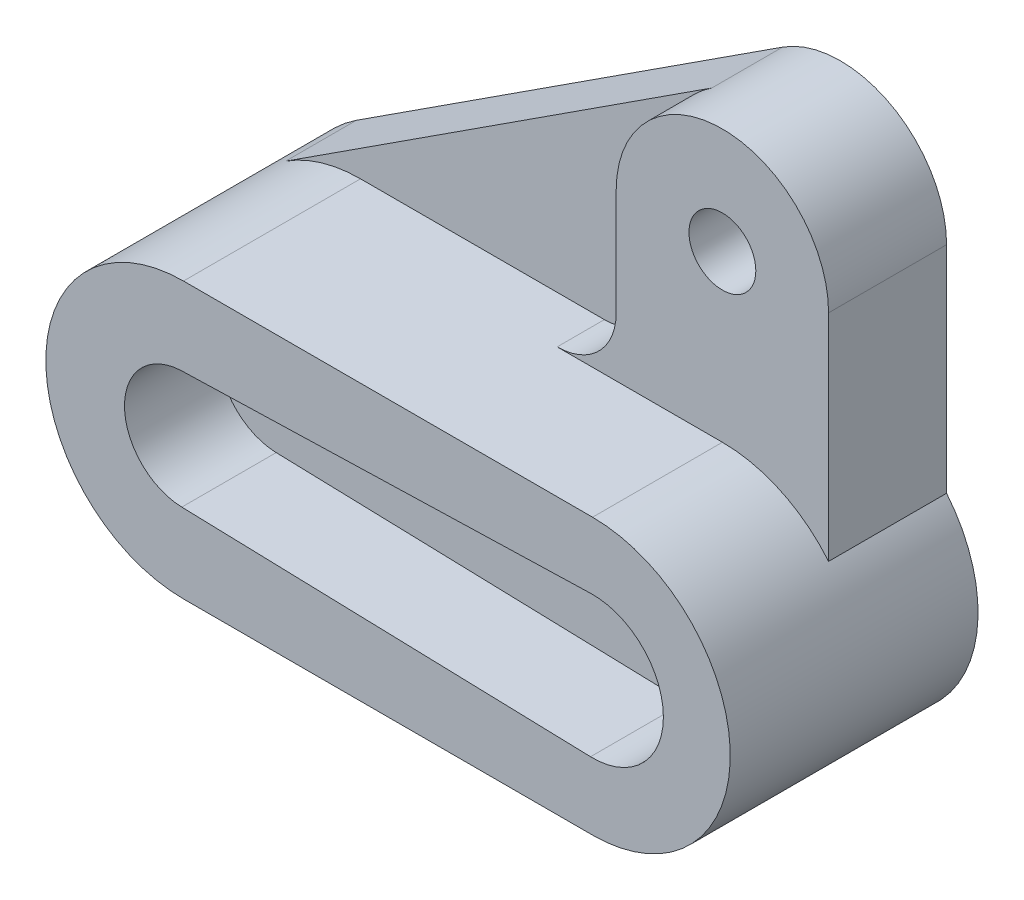
ISO-10303-21;
HEADER;
FILE_DESCRIPTION(('STEP AP214'),'2;1');
FILE_NAME('part.step','',(''),(''),'','','');
FILE_SCHEMA(('AUTOMOTIVE_DESIGN { 1 0 10303 214 1 1 1 1 }'));
ENDSEC;
DATA;
#1=APPLICATION_CONTEXT('core data for automotive mechanical design processes');
#2=APPLICATION_PROTOCOL_DEFINITION('international standard','automotive_design',2000,#1);
#3=PRODUCT_CONTEXT('',#1,'mechanical');
#4=PRODUCT('Part','Part','',(#3));
#5=PRODUCT_RELATED_PRODUCT_CATEGORY('part','',(#4));
#6=PRODUCT_DEFINITION_FORMATION('','',#4);
#7=PRODUCT_DEFINITION_CONTEXT('part definition',#1,'design');
#8=PRODUCT_DEFINITION('design','',#6,#7);
#9=PRODUCT_DEFINITION_SHAPE('','',#8);
#10=(LENGTH_UNIT() NAMED_UNIT(*) SI_UNIT(.MILLI.,.METRE.));
#11=(NAMED_UNIT(*) PLANE_ANGLE_UNIT() SI_UNIT($,.RADIAN.));
#12=(NAMED_UNIT(*) SI_UNIT($,.STERADIAN.) SOLID_ANGLE_UNIT());
#13=UNCERTAINTY_MEASURE_WITH_UNIT(LENGTH_MEASURE(1.E-05),#10,'distance_accuracy_value','');
#14=(GEOMETRIC_REPRESENTATION_CONTEXT(3) GLOBAL_UNCERTAINTY_ASSIGNED_CONTEXT((#13)) GLOBAL_UNIT_ASSIGNED_CONTEXT((#10,
#11,#12)) REPRESENTATION_CONTEXT('',''));
#15=CARTESIAN_POINT('',(0.,0.,0.));
#16=DIRECTION('',(0.,0.,1.));
#17=DIRECTION('',(1.,0.,0.));
#18=AXIS2_PLACEMENT_3D('',#15,#16,#17);
#19=CARTESIAN_POINT('',(-58.2524439912202,0.,-15.));
#20=DIRECTION('',(0.,0.,1.));
#21=DIRECTION('',(1.,0.,0.));
#22=AXIS2_PLACEMENT_3D('',#19,#20,#21);
#23=CYLINDRICAL_SURFACE('',#22,35.);
#24=CARTESIAN_POINT('',(-58.2524439912202,0.,3.));
#25=DIRECTION('',(0.,0.,1.));
#26=DIRECTION('',(1.,0.,0.));
#27=AXIS2_PLACEMENT_3D('',#24,#25,#26);
#28=CIRCLE('',#27,35.);
#29=CARTESIAN_POINT('',(-58.2524439912202,35.,3.));
#30=VERTEX_POINT('',#29);
#31=CARTESIAN_POINT('',(-77.3000748466596,29.3630338826715,3.));
#32=VERTEX_POINT('',#31);
#33=EDGE_CURVE('E57',#30,#32,#28,.T.);
#34=ORIENTED_EDGE('',*,*,#33,.T.);
#35=DIRECTION('',(0.,0.,1.));
#36=VECTOR('',#35,1.);
#37=CARTESIAN_POINT('',(-77.3000748466596,29.3630338826715,-15.));
#38=LINE('',#37,#36);
#39=CARTESIAN_POINT('',(-77.3000748466596,29.3630338826715,-15.));
#40=VERTEX_POINT('',#39);
#41=EDGE_CURVE('E184',#40,#32,#38,.T.);
#42=ORIENTED_EDGE('',*,*,#41,.F.);
#43=CARTESIAN_POINT('',(-58.2524439912202,0.,-15.));
#44=DIRECTION('',(0.,0.,1.));
#45=DIRECTION('',(1.,0.,0.));
#46=AXIS2_PLACEMENT_3D('',#43,#44,#45);
#47=CIRCLE('',#46,35.);
#48=CARTESIAN_POINT('',(-58.2524439912202,-35.,-15.));
#49=VERTEX_POINT('',#48);
#50=EDGE_CURVE('E342',#40,#49,#47,.T.);
#51=ORIENTED_EDGE('',*,*,#50,.T.);
#52=DIRECTION('',(0.,0.,1.));
#53=VECTOR('',#52,1.);
#54=CARTESIAN_POINT('',(-58.2524439912202,-35.,-15.));
#55=LINE('',#54,#53);
#56=CARTESIAN_POINT('',(-58.2524439912202,-35.,48.));
#57=VERTEX_POINT('',#56);
#58=EDGE_CURVE('E49',#49,#57,#55,.T.);
#59=ORIENTED_EDGE('',*,*,#58,.T.);
#60=CARTESIAN_POINT('',(-58.2524439912202,0.,48.));
#61=DIRECTION('',(0.,0.,1.));
#62=DIRECTION('',(1.,0.,0.));
#63=AXIS2_PLACEMENT_3D('',#60,#61,#62);
#64=CIRCLE('',#63,35.);
#65=CARTESIAN_POINT('',(-58.2524439912202,35.,48.));
#66=VERTEX_POINT('',#65);
#67=EDGE_CURVE('E316',#66,#57,#64,.T.);
#68=ORIENTED_EDGE('',*,*,#67,.F.);
#69=DIRECTION('',(0.,0.,1.));
#70=VECTOR('',#69,1.);
#71=CARTESIAN_POINT('',(-58.2524439912202,35.,-15.));
#72=LINE('',#71,#70);
#73=EDGE_CURVE('E352',#30,#66,#72,.T.);
#74=ORIENTED_EDGE('',*,*,#73,.F.);
#75=EDGE_LOOP('',(#34,#42,#51,#59,#68,#74));
#76=FACE_BOUND('',#75,.T.);
#77=ADVANCED_FACE('F39',(#76),#23,.T.);
#78=CARTESIAN_POINT('',(45.7475560087798,0.,-15.));
#79=DIRECTION('',(0.,0.,1.));
#80=DIRECTION('',(1.,0.,0.));
#81=AXIS2_PLACEMENT_3D('',#78,#79,#80);
#82=CYLINDRICAL_SURFACE('',#81,35.);
#83=CARTESIAN_POINT('',(45.7475560087798,0.,-15.));
#84=DIRECTION('',(0.,0.,1.));
#85=DIRECTION('',(1.,0.,0.));
#86=AXIS2_PLACEMENT_3D('',#83,#84,#85);
#87=CIRCLE('',#86,35.);
#88=CARTESIAN_POINT('',(45.7475560087798,-35.,-15.));
#89=VERTEX_POINT('',#88);
#90=CARTESIAN_POINT('',(72.7475560087798,22.2710574513201,-15.));
#91=VERTEX_POINT('',#90);
#92=EDGE_CURVE('E338',#89,#91,#87,.T.);
#93=ORIENTED_EDGE('',*,*,#92,.T.);
#94=DIRECTION('',(0.,0.,1.));
#95=VECTOR('',#94,1.);
#96=CARTESIAN_POINT('',(72.7475560087798,22.2710574513201,-15.));
#97=LINE('',#96,#95);
#98=CARTESIAN_POINT('',(72.7475560087798,22.2710574513201,15.));
#99=VERTEX_POINT('',#98);
#100=EDGE_CURVE('E257',#91,#99,#97,.T.);
#101=ORIENTED_EDGE('',*,*,#100,.T.);
#102=CARTESIAN_POINT('',(45.7475560087798,0.,15.));
#103=DIRECTION('',(0.,0.,1.));
#104=DIRECTION('',(1.,0.,0.));
#105=AXIS2_PLACEMENT_3D('',#102,#103,#104);
#106=CIRCLE('',#105,35.);
#107=CARTESIAN_POINT('',(45.7475560087798,35.,15.));
#108=VERTEX_POINT('',#107);
#109=EDGE_CURVE('E217',#99,#108,#106,.T.);
#110=ORIENTED_EDGE('',*,*,#109,.T.);
#111=DIRECTION('',(0.,0.,1.));
#112=VECTOR('',#111,1.);
#113=CARTESIAN_POINT('',(45.7475560087798,35.,-15.));
#114=LINE('',#113,#112);
#115=CARTESIAN_POINT('',(45.7475560087798,35.,48.));
#116=VERTEX_POINT('',#115);
#117=EDGE_CURVE('E355',#108,#116,#114,.T.);
#118=ORIENTED_EDGE('',*,*,#117,.T.);
#119=CARTESIAN_POINT('',(45.7475560087798,0.,48.));
#120=DIRECTION('',(0.,0.,1.));
#121=DIRECTION('',(1.,0.,0.));
#122=AXIS2_PLACEMENT_3D('',#119,#120,#121);
#123=CIRCLE('',#122,35.);
#124=CARTESIAN_POINT('',(45.7475560087798,-35.,48.));
#125=VERTEX_POINT('',#124);
#126=EDGE_CURVE('E308',#125,#116,#123,.T.);
#127=ORIENTED_EDGE('',*,*,#126,.F.);
#128=DIRECTION('',(0.,0.,1.));
#129=VECTOR('',#128,1.);
#130=CARTESIAN_POINT('',(45.7475560087798,-35.,-15.));
#131=LINE('',#130,#129);
#132=EDGE_CURVE('E11',#89,#125,#131,.T.);
#133=ORIENTED_EDGE('',*,*,#132,.F.);
#134=EDGE_LOOP('',(#93,#101,#110,#118,#127,#133));
#135=FACE_BOUND('',#134,.T.);
#136=ADVANCED_FACE('F417',(#135),#82,.T.);
#137=CARTESIAN_POINT('',(0.,35.,-15.));
#138=DIRECTION('',(0.,-1.,0.));
#139=DIRECTION('',(0.,0.,-1.));
#140=AXIS2_PLACEMENT_3D('',#137,#138,#139);
#141=PLANE('',#140);
#142=DIRECTION('',(0.,0.,1.));
#143=VECTOR('',#142,1.);
#144=CARTESIAN_POINT('',(3.74755600877969,35.,-15.));
#145=LINE('',#144,#143);
#146=CARTESIAN_POINT('',(3.74755600877969,35.,3.));
#147=VERTEX_POINT('',#146);
#148=CARTESIAN_POINT('',(3.74755600877969,35.,15.));
#149=VERTEX_POINT('',#148);
#150=EDGE_CURVE('E246',#147,#149,#145,.T.);
#151=ORIENTED_EDGE('',*,*,#150,.F.);
#152=DIRECTION('',(1.,0.,0.));
#153=VECTOR('',#152,1.);
#154=CARTESIAN_POINT('',(0.,35.,3.));
#155=LINE('',#154,#153);
#156=EDGE_CURVE('E65',#30,#147,#155,.T.);
#157=ORIENTED_EDGE('',*,*,#156,.F.);
#158=ORIENTED_EDGE('',*,*,#73,.T.);
#159=DIRECTION('',(1.,0.,0.));
#160=VECTOR('',#159,1.);
#161=CARTESIAN_POINT('',(0.,35.,48.));
#162=LINE('',#161,#160);
#163=EDGE_CURVE('E312',#66,#116,#162,.T.);
#164=ORIENTED_EDGE('',*,*,#163,.T.);
#165=ORIENTED_EDGE('',*,*,#117,.F.);
#166=DIRECTION('',(1.,0.,0.));
#167=VECTOR('',#166,1.);
#168=CARTESIAN_POINT('',(0.,35.,15.));
#169=LINE('',#168,#167);
#170=EDGE_CURVE('E214',#149,#108,#169,.T.);
#171=ORIENTED_EDGE('',*,*,#170,.F.);
#172=EDGE_LOOP('',(#151,#157,#158,#164,#165,#171));
#173=FACE_BOUND('',#172,.T.);
#174=ADVANCED_FACE('F422',(#173),#141,.F.);
#175=CARTESIAN_POINT('',(45.7475560087798,0.,-15.));
#176=DIRECTION('',(0.,0.,1.));
#177=DIRECTION('',(1.,0.,0.));
#178=AXIS2_PLACEMENT_3D('',#175,#176,#177);
#179=CYLINDRICAL_SURFACE('',#178,18.);
#180=CARTESIAN_POINT('',(45.7475560087798,0.,0.));
#181=DIRECTION('',(0.,0.,1.));
#182=DIRECTION('',(1.,0.,0.));
#183=AXIS2_PLACEMENT_3D('',#180,#181,#182);
#184=CIRCLE('',#183,18.);
#185=CARTESIAN_POINT('',(45.2283252395491,-17.9925095361454,0.));
#186=VERTEX_POINT('',#185);
#187=CARTESIAN_POINT('',(45.2283252395491,17.9925095361454,0.));
#188=VERTEX_POINT('',#187);
#189=EDGE_CURVE('E282',#186,#188,#184,.T.);
#190=ORIENTED_EDGE('',*,*,#189,.T.);
#191=DIRECTION('',(0.,0.,1.));
#192=VECTOR('',#191,1.);
#193=CARTESIAN_POINT('',(45.2283252395491,17.9925095361454,-15.));
#194=LINE('',#193,#192);
#195=CARTESIAN_POINT('',(45.2283252395491,17.9925095361454,-15.));
#196=VERTEX_POINT('',#195);
#197=EDGE_CURVE('E358',#196,#188,#194,.T.);
#198=ORIENTED_EDGE('',*,*,#197,.F.);
#199=CARTESIAN_POINT('',(45.7475560087798,0.,-15.));
#200=DIRECTION('',(0.,0.,1.));
#201=DIRECTION('',(1.,0.,0.));
#202=AXIS2_PLACEMENT_3D('',#199,#200,#201);
#203=CIRCLE('',#202,18.);
#204=CARTESIAN_POINT('',(45.2283252395491,-17.9925095361454,-15.));
#205=VERTEX_POINT('',#204);
#206=EDGE_CURVE('E324',#205,#196,#203,.T.);
#207=ORIENTED_EDGE('',*,*,#206,.F.);
#208=DIRECTION('',(0.,0.,1.));
#209=VECTOR('',#208,1.);
#210=CARTESIAN_POINT('',(45.2283252395491,-17.9925095361454,-15.));
#211=LINE('',#210,#209);
#212=EDGE_CURVE('E43',#205,#186,#211,.T.);
#213=ORIENTED_EDGE('',*,*,#212,.T.);
#214=EDGE_LOOP('',(#190,#198,#207,#213));
#215=FACE_BOUND('',#214,.T.);
#216=ADVANCED_FACE('F430',(#215),#179,.F.);
#217=CARTESIAN_POINT('',(-0.481164200806304,16.6734176487363,-15.));
#218=DIRECTION('',(-0.0288461538461538,0.99958386311919,0.));
#219=DIRECTION('',(-0.99958386311919,-0.0288461538461538,0.));
#220=AXIS2_PLACEMENT_3D('',#217,#218,#219);
#221=PLANE('',#220);
#222=DIRECTION('',(-0.99958386311919,-0.0288461538461538,0.));
#223=VECTOR('',#222,1.);
#224=CARTESIAN_POINT('',(-0.481164200806304,16.6734176487363,0.));
#225=LINE('',#224,#223);
#226=CARTESIAN_POINT('',(-58.6851362989125,14.9937579467879,0.));
#227=VERTEX_POINT('',#226);
#228=EDGE_CURVE('E286',#188,#227,#225,.T.);
#229=ORIENTED_EDGE('',*,*,#228,.T.);
#230=DIRECTION('',(0.,0.,1.));
#231=VECTOR('',#230,1.);
#232=CARTESIAN_POINT('',(-58.6851362989125,14.9937579467879,-15.));
#233=LINE('',#232,#231);
#234=CARTESIAN_POINT('',(-58.6851362989125,14.9937579467879,-15.));
#235=VERTEX_POINT('',#234);
#236=EDGE_CURVE('E363',#235,#227,#233,.T.);
#237=ORIENTED_EDGE('',*,*,#236,.F.);
#238=DIRECTION('',(-0.99958386311919,-0.0288461538461538,0.));
#239=VECTOR('',#238,1.);
#240=CARTESIAN_POINT('',(-0.481164200806304,16.6734176487363,-15.));
#241=LINE('',#240,#239);
#242=EDGE_CURVE('E335',#196,#235,#241,.T.);
#243=ORIENTED_EDGE('',*,*,#242,.F.);
#244=ORIENTED_EDGE('',*,*,#197,.T.);
#245=EDGE_LOOP('',(#229,#237,#243,#244));
#246=FACE_BOUND('',#245,.T.);
#247=ADVANCED_FACE('F413',(#246),#221,.F.);
#248=CARTESIAN_POINT('',(-58.2524439912202,0.,-15.));
#249=DIRECTION('',(0.,0.,1.));
#250=DIRECTION('',(1.,0.,0.));
#251=AXIS2_PLACEMENT_3D('',#248,#249,#250);
#252=CYLINDRICAL_SURFACE('',#251,15.);
#253=CARTESIAN_POINT('',(-58.2524439912202,0.,0.));
#254=DIRECTION('',(0.,0.,1.));
#255=DIRECTION('',(1.,0.,0.));
#256=AXIS2_PLACEMENT_3D('',#253,#254,#255);
#257=CIRCLE('',#256,15.);
#258=CARTESIAN_POINT('',(-58.6851362989125,-14.9937579467879,0.));
#259=VERTEX_POINT('',#258);
#260=EDGE_CURVE('E267',#227,#259,#257,.T.);
#261=ORIENTED_EDGE('',*,*,#260,.T.);
#262=DIRECTION('',(0.,0.,1.));
#263=VECTOR('',#262,1.);
#264=CARTESIAN_POINT('',(-58.6851362989125,-14.9937579467879,-15.));
#265=LINE('',#264,#263);
#266=CARTESIAN_POINT('',(-58.6851362989125,-14.9937579467879,-15.));
#267=VERTEX_POINT('',#266);
#268=EDGE_CURVE('E367',#267,#259,#265,.T.);
#269=ORIENTED_EDGE('',*,*,#268,.F.);
#270=CARTESIAN_POINT('',(-58.2524439912202,0.,-15.));
#271=DIRECTION('',(0.,0.,1.));
#272=DIRECTION('',(1.,0.,0.));
#273=AXIS2_PLACEMENT_3D('',#270,#271,#272);
#274=CIRCLE('',#273,15.);
#275=EDGE_CURVE('E332',#235,#267,#274,.T.);
#276=ORIENTED_EDGE('',*,*,#275,.F.);
#277=ORIENTED_EDGE('',*,*,#236,.T.);
#278=EDGE_LOOP('',(#261,#269,#276,#277));
#279=FACE_BOUND('',#278,.T.);
#280=ADVANCED_FACE('F405',(#279),#252,.F.);
#281=CARTESIAN_POINT('',(-0.481164200806303,-16.6734176487363,-15.));
#282=DIRECTION('',(0.0288461538461538,0.99958386311919,0.));
#283=DIRECTION('',(-0.99958386311919,0.0288461538461538,0.));
#284=AXIS2_PLACEMENT_3D('',#281,#282,#283);
#285=PLANE('',#284);
#286=ORIENTED_EDGE('',*,*,#268,.T.);
#287=DIRECTION('',(-0.99958386311919,0.0288461538461538,0.));
#288=VECTOR('',#287,1.);
#289=CARTESIAN_POINT('',(-0.481164200806303,-16.6734176487363,0.));
#290=LINE('',#289,#288);
#291=EDGE_CURVE('E250',#186,#259,#290,.T.);
#292=ORIENTED_EDGE('',*,*,#291,.F.);
#293=ORIENTED_EDGE('',*,*,#212,.F.);
#294=DIRECTION('',(-0.99958386311919,0.0288461538461538,0.));
#295=VECTOR('',#294,1.);
#296=CARTESIAN_POINT('',(-0.481164200806303,-16.6734176487363,-15.));
#297=LINE('',#296,#295);
#298=EDGE_CURVE('E328',#205,#267,#297,.T.);
#299=ORIENTED_EDGE('',*,*,#298,.T.);
#300=EDGE_LOOP('',(#286,#292,#293,#299));
#301=FACE_BOUND('',#300,.T.);
#302=ADVANCED_FACE('F411',(#301),#285,.T.);
#303=CARTESIAN_POINT('',(0.,-35.,-15.));
#304=DIRECTION('',(0.,-1.,0.));
#305=DIRECTION('',(1.,0.,0.));
#306=AXIS2_PLACEMENT_3D('',#303,#304,#305);
#307=PLANE('',#306);
#308=ORIENTED_EDGE('',*,*,#132,.T.);
#309=DIRECTION('',(1.,0.,0.));
#310=VECTOR('',#309,1.);
#311=CARTESIAN_POINT('',(0.,-35.,48.));
#312=LINE('',#311,#310);
#313=EDGE_CURVE('E320',#57,#125,#312,.T.);
#314=ORIENTED_EDGE('',*,*,#313,.F.);
#315=ORIENTED_EDGE('',*,*,#58,.F.);
#316=DIRECTION('',(1.,0.,0.));
#317=VECTOR('',#316,1.);
#318=CARTESIAN_POINT('',(0.,-35.,-15.));
#319=LINE('',#318,#317);
#320=EDGE_CURVE('E345',#49,#89,#319,.T.);
#321=ORIENTED_EDGE('',*,*,#320,.T.);
#322=EDGE_LOOP('',(#308,#314,#315,#321));
#323=FACE_BOUND('',#322,.T.);
#324=ADVANCED_FACE('F427',(#323),#307,.T.);
#325=CARTESIAN_POINT('',(45.2283252395491,17.9925095361454,24.));
#326=VERTEX_POINT('',#325);
#327=CARTESIAN_POINT('',(45.2283252395491,17.9925095361454,48.));
#328=VERTEX_POINT('',#327);
#329=EDGE_CURVE('E362',#326,#328,#194,.T.);
#330=ORIENTED_EDGE('',*,*,#329,.F.);
#331=CARTESIAN_POINT('',(45.7475560087798,0.,24.));
#332=DIRECTION('',(0.,0.,1.));
#333=DIRECTION('',(1.,0.,0.));
#334=AXIS2_PLACEMENT_3D('',#331,#332,#333);
#335=CIRCLE('',#334,18.);
#336=CARTESIAN_POINT('',(45.2283252395491,-17.9925095361454,24.));
#337=VERTEX_POINT('',#336);
#338=EDGE_CURVE('E266',#337,#326,#335,.T.);
#339=ORIENTED_EDGE('',*,*,#338,.F.);
#340=CARTESIAN_POINT('',(45.2283252395491,-17.9925095361454,48.));
#341=VERTEX_POINT('',#340);
#342=EDGE_CURVE('E348',#337,#341,#211,.T.);
#343=ORIENTED_EDGE('',*,*,#342,.T.);
#344=CARTESIAN_POINT('',(45.7475560087798,0.,48.));
#345=DIRECTION('',(0.,0.,1.));
#346=DIRECTION('',(1.,0.,0.));
#347=AXIS2_PLACEMENT_3D('',#344,#345,#346);
#348=CIRCLE('',#347,18.);
#349=EDGE_CURVE('E279',#341,#328,#348,.T.);
#350=ORIENTED_EDGE('',*,*,#349,.T.);
#351=EDGE_LOOP('',(#330,#339,#343,#350));
#352=FACE_BOUND('',#351,.T.);
#353=ADVANCED_FACE('F41',(#352),#179,.F.);
#354=CARTESIAN_POINT('',(-58.6851362989125,14.9937579467879,24.));
#355=VERTEX_POINT('',#354);
#356=CARTESIAN_POINT('',(-58.6851362989125,14.9937579467879,48.));
#357=VERTEX_POINT('',#356);
#358=EDGE_CURVE('E366',#355,#357,#233,.T.);
#359=ORIENTED_EDGE('',*,*,#358,.F.);
#360=DIRECTION('',(-0.99958386311919,-0.0288461538461538,0.));
#361=VECTOR('',#360,1.);
#362=CARTESIAN_POINT('',(-0.481164200806304,16.6734176487363,24.));
#363=LINE('',#362,#361);
#364=EDGE_CURVE('E271',#326,#355,#363,.T.);
#365=ORIENTED_EDGE('',*,*,#364,.F.);
#366=ORIENTED_EDGE('',*,*,#329,.T.);
#367=DIRECTION('',(-0.99958386311919,-0.0288461538461538,0.));
#368=VECTOR('',#367,1.);
#369=CARTESIAN_POINT('',(-0.481164200806304,16.6734176487363,48.));
#370=LINE('',#369,#368);
#371=EDGE_CURVE('E304',#328,#357,#370,.T.);
#372=ORIENTED_EDGE('',*,*,#371,.T.);
#373=EDGE_LOOP('',(#359,#365,#366,#372));
#374=FACE_BOUND('',#373,.T.);
#375=ADVANCED_FACE('F397',(#374),#221,.F.);
#376=CARTESIAN_POINT('',(-58.6851362989125,-14.9937579467879,24.));
#377=VERTEX_POINT('',#376);
#378=CARTESIAN_POINT('',(-58.6851362989125,-14.9937579467879,48.));
#379=VERTEX_POINT('',#378);
#380=EDGE_CURVE('E370',#377,#379,#265,.T.);
#381=ORIENTED_EDGE('',*,*,#380,.F.);
#382=CARTESIAN_POINT('',(-58.2524439912202,0.,24.));
#383=DIRECTION('',(0.,0.,1.));
#384=DIRECTION('',(1.,0.,0.));
#385=AXIS2_PLACEMENT_3D('',#382,#383,#384);
#386=CIRCLE('',#385,15.);
#387=EDGE_CURVE('E275',#355,#377,#386,.T.);
#388=ORIENTED_EDGE('',*,*,#387,.F.);
#389=ORIENTED_EDGE('',*,*,#358,.T.);
#390=CARTESIAN_POINT('',(-58.2524439912202,0.,48.));
#391=DIRECTION('',(0.,0.,1.));
#392=DIRECTION('',(1.,0.,0.));
#393=AXIS2_PLACEMENT_3D('',#390,#391,#392);
#394=CIRCLE('',#393,15.);
#395=EDGE_CURVE('E300',#357,#379,#394,.T.);
#396=ORIENTED_EDGE('',*,*,#395,.T.);
#397=EDGE_LOOP('',(#381,#388,#389,#396));
#398=FACE_BOUND('',#397,.T.);
#399=ADVANCED_FACE('F402',(#398),#252,.F.);
#400=DIRECTION('',(-0.99958386311919,0.0288461538461538,0.));
#401=VECTOR('',#400,1.);
#402=CARTESIAN_POINT('',(-0.481164200806303,-16.6734176487363,24.));
#403=LINE('',#402,#401);
#404=EDGE_CURVE('E263',#337,#377,#403,.T.);
#405=ORIENTED_EDGE('',*,*,#404,.T.);
#406=ORIENTED_EDGE('',*,*,#380,.T.);
#407=DIRECTION('',(-0.99958386311919,0.0288461538461538,0.));
#408=VECTOR('',#407,1.);
#409=CARTESIAN_POINT('',(-0.481164200806303,-16.6734176487363,48.));
#410=LINE('',#409,#408);
#411=EDGE_CURVE('E296',#341,#379,#410,.T.);
#412=ORIENTED_EDGE('',*,*,#411,.F.);
#413=ORIENTED_EDGE('',*,*,#342,.F.);
#414=EDGE_LOOP('',(#405,#406,#412,#413));
#415=FACE_BOUND('',#414,.T.);
#416=ADVANCED_FACE('F390',(#415),#285,.T.);
#417=CARTESIAN_POINT('',(0.,0.,-15.));
#418=DIRECTION('',(0.,0.,1.));
#419=DIRECTION('',(1.,0.,0.));
#420=AXIS2_PLACEMENT_3D('',#417,#418,#419);
#421=PLANE('',#420);
#422=ORIENTED_EDGE('',*,*,#50,.F.);
#423=DIRECTION('',(-0.838943825219184,-0.544218024441127,0.));
#424=VECTOR('',#423,1.);
#425=CARTESIAN_POINT('',(-36.3004469861566,55.9592561878239,-15.));
#426=LINE('',#425,#424);
#427=CARTESIAN_POINT('',(31.0536693488694,99.651483280918,-15.));
#428=VERTEX_POINT('',#427);
#429=EDGE_CURVE('E185',#428,#40,#426,.T.);
#430=ORIENTED_EDGE('',*,*,#429,.F.);
#431=CARTESIAN_POINT('',(45.7475560087798,77.,-15.));
#432=DIRECTION('',(0.,0.,1.));
#433=DIRECTION('',(1.,0.,0.));
#434=AXIS2_PLACEMENT_3D('',#431,#432,#433);
#435=CIRCLE('',#434,27.);
#436=CARTESIAN_POINT('',(72.7475560087798,77.,-15.));
#437=VERTEX_POINT('',#436);
#438=EDGE_CURVE('E179',#437,#428,#435,.T.);
#439=ORIENTED_EDGE('',*,*,#438,.F.);
#440=DIRECTION('',(0.,-1.,0.));
#441=VECTOR('',#440,1.);
#442=CARTESIAN_POINT('',(72.7475560087798,0.,-15.));
#443=LINE('',#442,#441);
#444=EDGE_CURVE('E237',#437,#91,#443,.T.);
#445=ORIENTED_EDGE('',*,*,#444,.T.);
#446=ORIENTED_EDGE('',*,*,#92,.F.);
#447=ORIENTED_EDGE('',*,*,#320,.F.);
#448=EDGE_LOOP('',(#422,#430,#439,#445,#446,#447));
#449=FACE_BOUND('',#448,.T.);
#450=ORIENTED_EDGE('',*,*,#206,.T.);
#451=ORIENTED_EDGE('',*,*,#242,.T.);
#452=ORIENTED_EDGE('',*,*,#275,.T.);
#453=ORIENTED_EDGE('',*,*,#298,.F.);
#454=EDGE_LOOP('',(#450,#451,#452,#453));
#455=FACE_BOUND('',#454,.T.);
#456=CARTESIAN_POINT('',(45.7475560087798,77.,-15.));
#457=DIRECTION('',(0.,0.,1.));
#458=DIRECTION('',(1.,0.,0.));
#459=AXIS2_PLACEMENT_3D('',#456,#457,#458);
#460=CIRCLE('',#459,8.5);
#461=CARTESIAN_POINT('',(54.2475560087798,77.,-15.));
#462=VERTEX_POINT('',#461);
#463=EDGE_CURVE('E242',#462,#462,#460,.T.);
#464=ORIENTED_EDGE('',*,*,#463,.T.);
#465=EDGE_LOOP('',(#464));
#466=FACE_BOUND('',#465,.T.);
#467=ADVANCED_FACE('F410',(#449,#455,#466),#421,.F.);
#468=CARTESIAN_POINT('',(0.,0.,48.));
#469=DIRECTION('',(0.,0.,1.));
#470=DIRECTION('',(1.,0.,0.));
#471=AXIS2_PLACEMENT_3D('',#468,#469,#470);
#472=PLANE('',#471);
#473=ORIENTED_EDGE('',*,*,#349,.F.);
#474=ORIENTED_EDGE('',*,*,#411,.T.);
#475=ORIENTED_EDGE('',*,*,#395,.F.);
#476=ORIENTED_EDGE('',*,*,#371,.F.);
#477=EDGE_LOOP('',(#473,#474,#475,#476));
#478=FACE_BOUND('',#477,.T.);
#479=ORIENTED_EDGE('',*,*,#126,.T.);
#480=ORIENTED_EDGE('',*,*,#163,.F.);
#481=ORIENTED_EDGE('',*,*,#67,.T.);
#482=ORIENTED_EDGE('',*,*,#313,.T.);
#483=EDGE_LOOP('',(#479,#480,#481,#482));
#484=FACE_BOUND('',#483,.T.);
#485=ADVANCED_FACE('F393',(#478,#484),#472,.T.);
#486=CARTESIAN_POINT('',(0.,0.,0.));
#487=DIRECTION('',(0.,0.,1.));
#488=DIRECTION('',(1.,0.,0.));
#489=AXIS2_PLACEMENT_3D('',#486,#487,#488);
#490=PLANE('',#489);
#491=ORIENTED_EDGE('',*,*,#291,.T.);
#492=ORIENTED_EDGE('',*,*,#260,.F.);
#493=ORIENTED_EDGE('',*,*,#228,.F.);
#494=ORIENTED_EDGE('',*,*,#189,.F.);
#495=EDGE_LOOP('',(#491,#492,#493,#494));
#496=FACE_BOUND('',#495,.T.);
#497=ADVANCED_FACE('F467',(#496),#490,.F.);
#498=CARTESIAN_POINT('',(0.,0.,24.));
#499=DIRECTION('',(0.,0.,1.));
#500=DIRECTION('',(1.,0.,0.));
#501=AXIS2_PLACEMENT_3D('',#498,#499,#500);
#502=PLANE('',#501);
#503=ORIENTED_EDGE('',*,*,#404,.F.);
#504=ORIENTED_EDGE('',*,*,#338,.T.);
#505=ORIENTED_EDGE('',*,*,#364,.T.);
#506=ORIENTED_EDGE('',*,*,#387,.T.);
#507=EDGE_LOOP('',(#503,#504,#505,#506));
#508=FACE_BOUND('',#507,.T.);
#509=ADVANCED_FACE('F400',(#508),#502,.T.);
#510=CARTESIAN_POINT('',(3.74755600877979,50.,-15.));
#511=DIRECTION('',(0.,0.,1.));
#512=DIRECTION('',(1.,0.,0.));
#513=AXIS2_PLACEMENT_3D('',#510,#511,#512);
#514=CYLINDRICAL_SURFACE('',#513,15.);
#515=DIRECTION('',(0.,0.,1.));
#516=VECTOR('',#515,1.);
#517=CARTESIAN_POINT('',(18.7475560087798,50.0000000000001,-15.));
#518=LINE('',#517,#516);
#519=CARTESIAN_POINT('',(18.7475560087798,50.0000000000001,3.));
#520=VERTEX_POINT('',#519);
#521=CARTESIAN_POINT('',(18.7475560087798,50.0000000000001,15.));
#522=VERTEX_POINT('',#521);
#523=EDGE_CURVE('E247',#520,#522,#518,.T.);
#524=ORIENTED_EDGE('',*,*,#523,.F.);
#525=CARTESIAN_POINT('',(3.74755600877979,50.,3.));
#526=DIRECTION('',(0.,0.,1.));
#527=DIRECTION('',(1.,0.,0.));
#528=AXIS2_PLACEMENT_3D('',#525,#526,#527);
#529=CIRCLE('',#528,15.);
#530=EDGE_CURVE('E200',#147,#520,#529,.T.);
#531=ORIENTED_EDGE('',*,*,#530,.F.);
#532=ORIENTED_EDGE('',*,*,#150,.T.);
#533=CARTESIAN_POINT('',(3.74755600877979,50.,15.));
#534=DIRECTION('',(0.,0.,1.));
#535=DIRECTION('',(1.,0.,0.));
#536=AXIS2_PLACEMENT_3D('',#533,#534,#535);
#537=CIRCLE('',#536,15.);
#538=EDGE_CURVE('E209',#149,#522,#537,.T.);
#539=ORIENTED_EDGE('',*,*,#538,.T.);
#540=EDGE_LOOP('',(#524,#531,#532,#539));
#541=FACE_BOUND('',#540,.T.);
#542=ADVANCED_FACE('F442',(#541),#514,.F.);
#543=CARTESIAN_POINT('',(18.7475560087798,0.,-15.));
#544=DIRECTION('',(-1.,0.,0.));
#545=DIRECTION('',(0.,-1.,0.));
#546=AXIS2_PLACEMENT_3D('',#543,#544,#545);
#547=PLANE('',#546);
#548=DIRECTION('',(0.,-1.,0.));
#549=VECTOR('',#548,1.);
#550=CARTESIAN_POINT('',(18.7475560087798,0.,3.));
#551=LINE('',#550,#549);
#552=CARTESIAN_POINT('',(18.7475560087798,77.,3.));
#553=VERTEX_POINT('',#552);
#554=EDGE_CURVE('E196',#553,#520,#551,.T.);
#555=ORIENTED_EDGE('',*,*,#554,.T.);
#556=ORIENTED_EDGE('',*,*,#523,.T.);
#557=DIRECTION('',(0.,-1.,0.));
#558=VECTOR('',#557,1.);
#559=CARTESIAN_POINT('',(18.7475560087798,0.,15.));
#560=LINE('',#559,#558);
#561=CARTESIAN_POINT('',(18.7475560087798,77.,15.));
#562=VERTEX_POINT('',#561);
#563=EDGE_CURVE('E229',#562,#522,#560,.T.);
#564=ORIENTED_EDGE('',*,*,#563,.F.);
#565=DIRECTION('',(0.,0.,1.));
#566=VECTOR('',#565,1.);
#567=CARTESIAN_POINT('',(18.7475560087798,77.,-15.));
#568=LINE('',#567,#566);
#569=EDGE_CURVE('E251',#553,#562,#568,.T.);
#570=ORIENTED_EDGE('',*,*,#569,.F.);
#571=EDGE_LOOP('',(#555,#556,#564,#570));
#572=FACE_BOUND('',#571,.T.);
#573=ADVANCED_FACE('F445',(#572),#547,.T.);
#574=CARTESIAN_POINT('',(45.7475560087798,77.,-15.));
#575=DIRECTION('',(0.,0.,1.));
#576=DIRECTION('',(1.,0.,0.));
#577=AXIS2_PLACEMENT_3D('',#574,#575,#576);
#578=CYLINDRICAL_SURFACE('',#577,27.);
#579=DIRECTION('',(0.,0.,1.));
#580=VECTOR('',#579,1.);
#581=CARTESIAN_POINT('',(31.0536693488694,99.651483280918,-15.));
#582=LINE('',#581,#580);
#583=CARTESIAN_POINT('',(31.0536693488694,99.651483280918,3.));
#584=VERTEX_POINT('',#583);
#585=EDGE_CURVE('E172',#428,#584,#582,.T.);
#586=ORIENTED_EDGE('',*,*,#585,.T.);
#587=CARTESIAN_POINT('',(45.7475560087798,77.,3.));
#588=DIRECTION('',(0.,0.,1.));
#589=DIRECTION('',(1.,0.,0.));
#590=AXIS2_PLACEMENT_3D('',#587,#588,#589);
#591=CIRCLE('',#590,27.);
#592=EDGE_CURVE('E176',#584,#553,#591,.T.);
#593=ORIENTED_EDGE('',*,*,#592,.T.);
#594=ORIENTED_EDGE('',*,*,#569,.T.);
#595=CARTESIAN_POINT('',(45.7475560087798,77.,15.));
#596=DIRECTION('',(0.,0.,1.));
#597=DIRECTION('',(1.,0.,0.));
#598=AXIS2_PLACEMENT_3D('',#595,#596,#597);
#599=CIRCLE('',#598,27.);
#600=CARTESIAN_POINT('',(72.7475560087798,77.,15.));
#601=VERTEX_POINT('',#600);
#602=EDGE_CURVE('E225',#601,#562,#599,.T.);
#603=ORIENTED_EDGE('',*,*,#602,.F.);
#604=DIRECTION('',(0.,0.,1.));
#605=VECTOR('',#604,1.);
#606=CARTESIAN_POINT('',(72.7475560087798,77.,-15.));
#607=LINE('',#606,#605);
#608=EDGE_CURVE('E254',#437,#601,#607,.T.);
#609=ORIENTED_EDGE('',*,*,#608,.F.);
#610=ORIENTED_EDGE('',*,*,#438,.T.);
#611=EDGE_LOOP('',(#586,#593,#594,#603,#609,#610));
#612=FACE_BOUND('',#611,.T.);
#613=ADVANCED_FACE('F174',(#612),#578,.T.);
#614=CARTESIAN_POINT('',(72.7475560087798,0.,-15.));
#615=DIRECTION('',(-1.,0.,0.));
#616=DIRECTION('',(0.,0.,1.));
#617=AXIS2_PLACEMENT_3D('',#614,#615,#616);
#618=PLANE('',#617);
#619=ORIENTED_EDGE('',*,*,#608,.T.);
#620=DIRECTION('',(0.,-1.,0.));
#621=VECTOR('',#620,1.);
#622=CARTESIAN_POINT('',(72.7475560087798,0.,15.));
#623=LINE('',#622,#621);
#624=EDGE_CURVE('E221',#601,#99,#623,.T.);
#625=ORIENTED_EDGE('',*,*,#624,.T.);
#626=ORIENTED_EDGE('',*,*,#100,.F.);
#627=ORIENTED_EDGE('',*,*,#444,.F.);
#628=EDGE_LOOP('',(#619,#625,#626,#627));
#629=FACE_BOUND('',#628,.T.);
#630=ADVANCED_FACE('F454',(#629),#618,.F.);
#631=CARTESIAN_POINT('',(45.7475560087798,77.,-15.));
#632=DIRECTION('',(0.,0.,1.));
#633=DIRECTION('',(1.,0.,0.));
#634=AXIS2_PLACEMENT_3D('',#631,#632,#633);
#635=CYLINDRICAL_SURFACE('',#634,8.5);
#636=ORIENTED_EDGE('',*,*,#463,.F.);
#637=EDGE_LOOP('',(#636));
#638=FACE_BOUND('',#637,.T.);
#639=CARTESIAN_POINT('',(45.7475560087798,77.,15.));
#640=DIRECTION('',(0.,0.,1.));
#641=DIRECTION('',(1.,0.,0.));
#642=AXIS2_PLACEMENT_3D('',#639,#640,#641);
#643=CIRCLE('',#642,8.5);
#644=CARTESIAN_POINT('',(54.2475560087798,77.,15.));
#645=VERTEX_POINT('',#644);
#646=EDGE_CURVE('E233',#645,#645,#643,.T.);
#647=ORIENTED_EDGE('',*,*,#646,.T.);
#648=EDGE_LOOP('',(#647));
#649=FACE_BOUND('',#648,.T.);
#650=ADVANCED_FACE('F482',(#638,#649),#635,.F.);
#651=CARTESIAN_POINT('',(0.,0.,15.));
#652=DIRECTION('',(0.,0.,1.));
#653=DIRECTION('',(1.,0.,0.));
#654=AXIS2_PLACEMENT_3D('',#651,#652,#653);
#655=PLANE('',#654);
#656=ORIENTED_EDGE('',*,*,#538,.F.);
#657=ORIENTED_EDGE('',*,*,#170,.T.);
#658=ORIENTED_EDGE('',*,*,#109,.F.);
#659=ORIENTED_EDGE('',*,*,#624,.F.);
#660=ORIENTED_EDGE('',*,*,#602,.T.);
#661=ORIENTED_EDGE('',*,*,#563,.T.);
#662=EDGE_LOOP('',(#656,#657,#658,#659,#660,#661));
#663=FACE_BOUND('',#662,.T.);
#664=ORIENTED_EDGE('',*,*,#646,.F.);
#665=EDGE_LOOP('',(#664));
#666=FACE_BOUND('',#665,.T.);
#667=ADVANCED_FACE('F447',(#663,#666),#655,.T.);
#668=CARTESIAN_POINT('',(-36.3004469861566,55.9592561878239,-15.));
#669=DIRECTION('',(-0.544218024441127,0.838943825219184,0.));
#670=DIRECTION('',(-0.838943825219184,-0.544218024441127,0.));
#671=AXIS2_PLACEMENT_3D('',#668,#669,#670);
#672=PLANE('',#671);
#673=ORIENTED_EDGE('',*,*,#41,.T.);
#674=DIRECTION('',(-0.838943825219184,-0.544218024441127,0.));
#675=VECTOR('',#674,1.);
#676=CARTESIAN_POINT('',(-36.3004469861566,55.9592561878239,3.));
#677=LINE('',#676,#675);
#678=EDGE_CURVE('E188',#584,#32,#677,.T.);
#679=ORIENTED_EDGE('',*,*,#678,.F.);
#680=ORIENTED_EDGE('',*,*,#585,.F.);
#681=ORIENTED_EDGE('',*,*,#429,.T.);
#682=EDGE_LOOP('',(#673,#679,#680,#681));
#683=FACE_BOUND('',#682,.T.);
#684=ADVANCED_FACE('F189',(#683),#672,.T.);
#685=CARTESIAN_POINT('',(0.,0.,3.));
#686=DIRECTION('',(0.,0.,1.));
#687=DIRECTION('',(1.,0.,0.));
#688=AXIS2_PLACEMENT_3D('',#685,#686,#687);
#689=PLANE('',#688);
#690=ORIENTED_EDGE('',*,*,#156,.T.);
#691=ORIENTED_EDGE('',*,*,#530,.T.);
#692=ORIENTED_EDGE('',*,*,#554,.F.);
#693=ORIENTED_EDGE('',*,*,#592,.F.);
#694=ORIENTED_EDGE('',*,*,#678,.T.);
#695=ORIENTED_EDGE('',*,*,#33,.F.);
#696=EDGE_LOOP('',(#690,#691,#692,#693,#694,#695));
#697=FACE_BOUND('',#696,.T.);
#698=ADVANCED_FACE('F194',(#697),#689,.T.);
#699=CLOSED_SHELL('',(#77,#136,#174,#216,#247,#280,#302,#324,#353,#375,#399,#416,#467,#485,#497,
#509,#542,#573,#613,#630,#650,#667,#684,#698));
#700=MANIFOLD_SOLID_BREP('B2',#699);
#701=ADVANCED_BREP_SHAPE_REPRESENTATION('',(#18,#700),#14);
#702=SHAPE_DEFINITION_REPRESENTATION(#9,#701);
ENDSEC;
END-ISO-10303-21;
